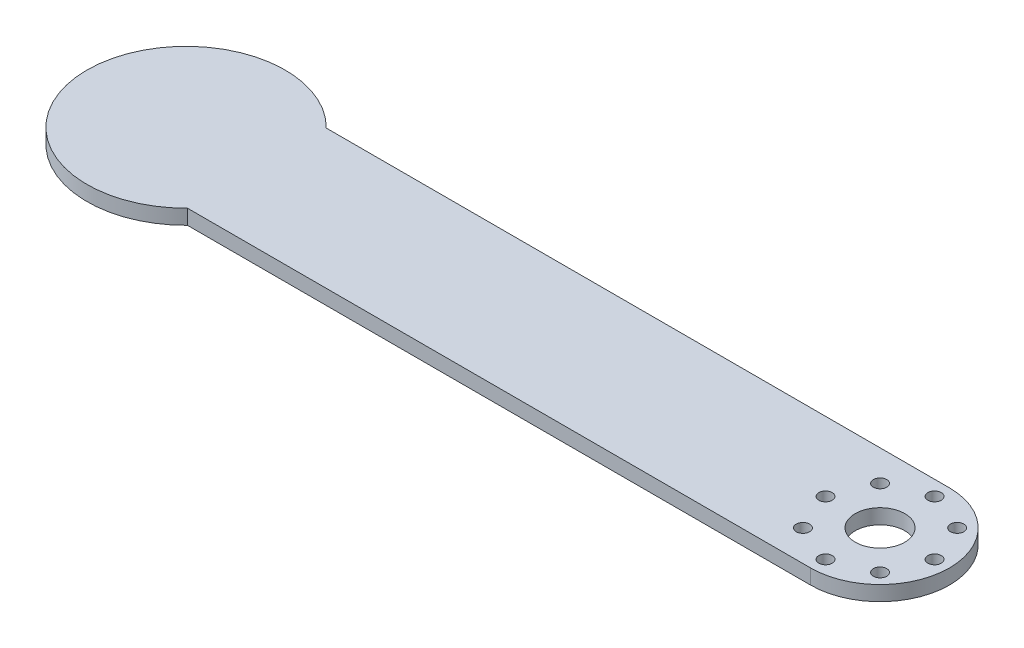
ISO-10303-21;
HEADER;
FILE_DESCRIPTION(('STEP AP214'),'2;1');
FILE_NAME('part.step','',(''),(''),'','','');
FILE_SCHEMA(('AUTOMOTIVE_DESIGN { 1 0 10303 214 1 1 1 1 }'));
ENDSEC;
DATA;
#1=APPLICATION_CONTEXT('core data for automotive mechanical design processes');
#2=APPLICATION_PROTOCOL_DEFINITION('international standard','automotive_design',2000,#1);
#3=PRODUCT_CONTEXT('',#1,'mechanical');
#4=PRODUCT('Part','Part','',(#3));
#5=PRODUCT_RELATED_PRODUCT_CATEGORY('part','',(#4));
#6=PRODUCT_DEFINITION_FORMATION('','',#4);
#7=PRODUCT_DEFINITION_CONTEXT('part definition',#1,'design');
#8=PRODUCT_DEFINITION('design','',#6,#7);
#9=PRODUCT_DEFINITION_SHAPE('','',#8);
#10=(LENGTH_UNIT() NAMED_UNIT(*) SI_UNIT(.MILLI.,.METRE.));
#11=(NAMED_UNIT(*) PLANE_ANGLE_UNIT() SI_UNIT($,.RADIAN.));
#12=(NAMED_UNIT(*) SI_UNIT($,.STERADIAN.) SOLID_ANGLE_UNIT());
#13=UNCERTAINTY_MEASURE_WITH_UNIT(LENGTH_MEASURE(1.E-05),#10,'distance_accuracy_value','');
#14=(GEOMETRIC_REPRESENTATION_CONTEXT(3) GLOBAL_UNCERTAINTY_ASSIGNED_CONTEXT((#13)) GLOBAL_UNIT_ASSIGNED_CONTEXT((#10,
#11,#12)) REPRESENTATION_CONTEXT('',''));
#15=CARTESIAN_POINT('',(0.,0.,0.));
#16=DIRECTION('',(0.,0.,1.));
#17=DIRECTION('',(1.,0.,0.));
#18=AXIS2_PLACEMENT_3D('',#15,#16,#17);
#19=CARTESIAN_POINT('',(140.,3.,0.));
#20=DIRECTION('',(0.,-1.,0.));
#21=DIRECTION('',(0.,0.,-1.));
#22=AXIS2_PLACEMENT_3D('',#19,#20,#21);
#23=PLANE('',#22);
#24=CARTESIAN_POINT('',(140.,3.,0.));
#25=DIRECTION('',(0.,1.,0.));
#26=DIRECTION('',(0.,0.,-1.));
#27=AXIS2_PLACEMENT_3D('',#24,#25,#26);
#28=CIRCLE('',#27,14.);
#29=CARTESIAN_POINT('',(140.,3.,14.));
#30=VERTEX_POINT('',#29);
#31=CARTESIAN_POINT('',(140.,3.,-14.));
#32=VERTEX_POINT('',#31);
#33=EDGE_CURVE('E87',#30,#32,#28,.T.);
#34=ORIENTED_EDGE('',*,*,#33,.T.);
#35=DIRECTION('',(-1.,0.,0.));
#36=VECTOR('',#35,1.);
#37=CARTESIAN_POINT('',(14.2828568570857,3.,-14.));
#38=LINE('',#37,#36);
#39=CARTESIAN_POINT('',(14.2828568570857,3.,-14.));
#40=VERTEX_POINT('',#39);
#41=EDGE_CURVE('E82',#32,#40,#38,.T.);
#42=ORIENTED_EDGE('',*,*,#41,.T.);
#43=CARTESIAN_POINT('',(0.,3.,0.));
#44=DIRECTION('',(0.,1.,0.));
#45=DIRECTION('',(0.,0.,1.));
#46=AXIS2_PLACEMENT_3D('',#43,#44,#45);
#47=CIRCLE('',#46,20.);
#48=CARTESIAN_POINT('',(14.2828568570857,3.,14.));
#49=VERTEX_POINT('',#48);
#50=EDGE_CURVE('E85',#40,#49,#47,.T.);
#51=ORIENTED_EDGE('',*,*,#50,.T.);
#52=DIRECTION('',(1.,0.,0.));
#53=VECTOR('',#52,1.);
#54=CARTESIAN_POINT('',(14.2828568570857,3.,14.));
#55=LINE('',#54,#53);
#56=EDGE_CURVE('E52',#49,#30,#55,.T.);
#57=ORIENTED_EDGE('',*,*,#56,.T.);
#58=EDGE_LOOP('',(#34,#42,#51,#57));
#59=FACE_BOUND('',#58,.T.);
#60=CARTESIAN_POINT('',(140.,3.,0.));
#61=DIRECTION('',(0.,1.,0.));
#62=DIRECTION('',(0.,0.,1.));
#63=AXIS2_PLACEMENT_3D('',#60,#61,#62);
#64=CIRCLE('',#63,4.99999999999999);
#65=CARTESIAN_POINT('',(140.,3.,4.99999999999998));
#66=VERTEX_POINT('',#65);
#67=EDGE_CURVE('E102',#66,#66,#64,.T.);
#68=ORIENTED_EDGE('',*,*,#67,.F.);
#69=EDGE_LOOP('',(#68));
#70=FACE_BOUND('',#69,.T.);
#71=CARTESIAN_POINT('',(140.,3.,-11.));
#72=DIRECTION('',(0.,1.,0.));
#73=DIRECTION('',(0.,0.,1.));
#74=AXIS2_PLACEMENT_3D('',#71,#72,#73);
#75=CIRCLE('',#74,1.35000000000001);
#76=CARTESIAN_POINT('',(140.,3.,-9.65));
#77=VERTEX_POINT('',#76);
#78=EDGE_CURVE('E117',#77,#77,#75,.T.);
#79=ORIENTED_EDGE('',*,*,#78,.F.);
#80=EDGE_LOOP('',(#79));
#81=FACE_BOUND('',#80,.T.);
#82=CARTESIAN_POINT('',(147.778174593052,3.,-7.77817459305199));
#83=DIRECTION('',(0.,1.,0.));
#84=DIRECTION('',(0.,0.,1.));
#85=AXIS2_PLACEMENT_3D('',#82,#83,#84);
#86=CIRCLE('',#85,1.35000000000001);
#87=CARTESIAN_POINT('',(147.778174593052,3.,-6.42817459305199));
#88=VERTEX_POINT('',#87);
#89=EDGE_CURVE('E123',#88,#88,#86,.T.);
#90=ORIENTED_EDGE('',*,*,#89,.F.);
#91=EDGE_LOOP('',(#90));
#92=FACE_BOUND('',#91,.T.);
#93=CARTESIAN_POINT('',(151.,3.,0.));
#94=DIRECTION('',(0.,1.,0.));
#95=DIRECTION('',(0.,0.,1.));
#96=AXIS2_PLACEMENT_3D('',#93,#94,#95);
#97=CIRCLE('',#96,1.35000000000001);
#98=CARTESIAN_POINT('',(151.,3.,1.35000000000002));
#99=VERTEX_POINT('',#98);
#100=EDGE_CURVE('E129',#99,#99,#97,.T.);
#101=ORIENTED_EDGE('',*,*,#100,.F.);
#102=EDGE_LOOP('',(#101));
#103=FACE_BOUND('',#102,.T.);
#104=CARTESIAN_POINT('',(147.778174593052,3.,7.77817459305202));
#105=DIRECTION('',(0.,1.,0.));
#106=DIRECTION('',(0.,0.,1.));
#107=AXIS2_PLACEMENT_3D('',#104,#105,#106);
#108=CIRCLE('',#107,1.35000000000001);
#109=CARTESIAN_POINT('',(147.778174593052,3.,9.12817459305203));
#110=VERTEX_POINT('',#109);
#111=EDGE_CURVE('E135',#110,#110,#108,.T.);
#112=ORIENTED_EDGE('',*,*,#111,.F.);
#113=EDGE_LOOP('',(#112));
#114=FACE_BOUND('',#113,.T.);
#115=CARTESIAN_POINT('',(140.,3.,11.));
#116=DIRECTION('',(0.,1.,0.));
#117=DIRECTION('',(0.,0.,1.));
#118=AXIS2_PLACEMENT_3D('',#115,#116,#117);
#119=CIRCLE('',#118,1.35000000000001);
#120=CARTESIAN_POINT('',(140.,3.,12.35));
#121=VERTEX_POINT('',#120);
#122=EDGE_CURVE('E141',#121,#121,#119,.T.);
#123=ORIENTED_EDGE('',*,*,#122,.F.);
#124=EDGE_LOOP('',(#123));
#125=FACE_BOUND('',#124,.T.);
#126=CARTESIAN_POINT('',(132.221825406948,3.,7.77817459305199));
#127=DIRECTION('',(0.,1.,0.));
#128=DIRECTION('',(0.,0.,1.));
#129=AXIS2_PLACEMENT_3D('',#126,#127,#128);
#130=CIRCLE('',#129,1.35000000000001);
#131=CARTESIAN_POINT('',(132.221825406948,3.,9.128174593052));
#132=VERTEX_POINT('',#131);
#133=EDGE_CURVE('E147',#132,#132,#130,.T.);
#134=ORIENTED_EDGE('',*,*,#133,.F.);
#135=EDGE_LOOP('',(#134));
#136=FACE_BOUND('',#135,.T.);
#137=CARTESIAN_POINT('',(129.,3.,0.));
#138=DIRECTION('',(0.,1.,0.));
#139=DIRECTION('',(0.,0.,1.));
#140=AXIS2_PLACEMENT_3D('',#137,#138,#139);
#141=CIRCLE('',#140,1.35000000000001);
#142=CARTESIAN_POINT('',(129.,3.,1.35000000000001));
#143=VERTEX_POINT('',#142);
#144=EDGE_CURVE('E153',#143,#143,#141,.T.);
#145=ORIENTED_EDGE('',*,*,#144,.F.);
#146=EDGE_LOOP('',(#145));
#147=FACE_BOUND('',#146,.T.);
#148=CARTESIAN_POINT('',(132.221825406948,3.,-7.77817459305204));
#149=DIRECTION('',(0.,1.,0.));
#150=DIRECTION('',(0.,0.,1.));
#151=AXIS2_PLACEMENT_3D('',#148,#149,#150);
#152=CIRCLE('',#151,1.35000000000004);
#153=CARTESIAN_POINT('',(132.221825406948,3.,-6.428174593052));
#154=VERTEX_POINT('',#153);
#155=EDGE_CURVE('E159',#154,#154,#152,.T.);
#156=ORIENTED_EDGE('',*,*,#155,.F.);
#157=EDGE_LOOP('',(#156));
#158=FACE_BOUND('',#157,.T.);
#159=ADVANCED_FACE('F35',(#59,#70,#81,#92,#103,#114,#125,#136,#147,#158),#23,.F.);
#160=CARTESIAN_POINT('',(140.,0.,0.));
#161=DIRECTION('',(0.,-1.,0.));
#162=DIRECTION('',(0.,0.,-1.));
#163=AXIS2_PLACEMENT_3D('',#160,#161,#162);
#164=PLANE('',#163);
#165=CARTESIAN_POINT('',(129.,0.,0.));
#166=DIRECTION('',(0.,1.,0.));
#167=DIRECTION('',(0.,0.,1.));
#168=AXIS2_PLACEMENT_3D('',#165,#166,#167);
#169=CIRCLE('',#168,1.35000000000001);
#170=CARTESIAN_POINT('',(129.,0.,1.35000000000001));
#171=VERTEX_POINT('',#170);
#172=EDGE_CURVE('E156',#171,#171,#169,.T.);
#173=ORIENTED_EDGE('',*,*,#172,.T.);
#174=EDGE_LOOP('',(#173));
#175=FACE_BOUND('',#174,.T.);
#176=CARTESIAN_POINT('',(140.,0.,11.));
#177=DIRECTION('',(0.,1.,0.));
#178=DIRECTION('',(0.,0.,1.));
#179=AXIS2_PLACEMENT_3D('',#176,#177,#178);
#180=CIRCLE('',#179,1.35000000000001);
#181=CARTESIAN_POINT('',(140.,0.,12.35));
#182=VERTEX_POINT('',#181);
#183=EDGE_CURVE('E144',#182,#182,#180,.T.);
#184=ORIENTED_EDGE('',*,*,#183,.T.);
#185=EDGE_LOOP('',(#184));
#186=FACE_BOUND('',#185,.T.);
#187=CARTESIAN_POINT('',(151.,0.,0.));
#188=DIRECTION('',(0.,1.,0.));
#189=DIRECTION('',(0.,0.,1.));
#190=AXIS2_PLACEMENT_3D('',#187,#188,#189);
#191=CIRCLE('',#190,1.35000000000001);
#192=CARTESIAN_POINT('',(151.,0.,1.35000000000002));
#193=VERTEX_POINT('',#192);
#194=EDGE_CURVE('E132',#193,#193,#191,.T.);
#195=ORIENTED_EDGE('',*,*,#194,.T.);
#196=EDGE_LOOP('',(#195));
#197=FACE_BOUND('',#196,.T.);
#198=CARTESIAN_POINT('',(140.,0.,-11.));
#199=DIRECTION('',(0.,1.,0.));
#200=DIRECTION('',(0.,0.,1.));
#201=AXIS2_PLACEMENT_3D('',#198,#199,#200);
#202=CIRCLE('',#201,1.35000000000001);
#203=CARTESIAN_POINT('',(140.,0.,-9.65));
#204=VERTEX_POINT('',#203);
#205=EDGE_CURVE('E120',#204,#204,#202,.T.);
#206=ORIENTED_EDGE('',*,*,#205,.T.);
#207=EDGE_LOOP('',(#206));
#208=FACE_BOUND('',#207,.T.);
#209=CARTESIAN_POINT('',(140.,0.,0.));
#210=DIRECTION('',(0.,1.,0.));
#211=DIRECTION('',(0.,0.,-1.));
#212=AXIS2_PLACEMENT_3D('',#209,#210,#211);
#213=CIRCLE('',#212,14.);
#214=CARTESIAN_POINT('',(140.,0.,14.));
#215=VERTEX_POINT('',#214);
#216=CARTESIAN_POINT('',(140.,0.,-14.));
#217=VERTEX_POINT('',#216);
#218=EDGE_CURVE('E99',#215,#217,#213,.T.);
#219=ORIENTED_EDGE('',*,*,#218,.F.);
#220=DIRECTION('',(1.,0.,0.));
#221=VECTOR('',#220,1.);
#222=CARTESIAN_POINT('',(14.2828568570857,0.,14.));
#223=LINE('',#222,#221);
#224=CARTESIAN_POINT('',(14.2828568570857,0.,14.));
#225=VERTEX_POINT('',#224);
#226=EDGE_CURVE('E75',#225,#215,#223,.T.);
#227=ORIENTED_EDGE('',*,*,#226,.F.);
#228=CARTESIAN_POINT('',(0.,0.,0.));
#229=DIRECTION('',(0.,1.,0.));
#230=DIRECTION('',(0.,0.,1.));
#231=AXIS2_PLACEMENT_3D('',#228,#229,#230);
#232=CIRCLE('',#231,20.);
#233=CARTESIAN_POINT('',(14.2828568570857,0.,-14.));
#234=VERTEX_POINT('',#233);
#235=EDGE_CURVE('E69',#234,#225,#232,.T.);
#236=ORIENTED_EDGE('',*,*,#235,.F.);
#237=DIRECTION('',(-1.,0.,0.));
#238=VECTOR('',#237,1.);
#239=CARTESIAN_POINT('',(14.2828568570857,0.,-14.));
#240=LINE('',#239,#238);
#241=EDGE_CURVE('E91',#217,#234,#240,.T.);
#242=ORIENTED_EDGE('',*,*,#241,.F.);
#243=EDGE_LOOP('',(#219,#227,#236,#242));
#244=FACE_BOUND('',#243,.T.);
#245=CARTESIAN_POINT('',(140.,0.,0.));
#246=DIRECTION('',(0.,1.,0.));
#247=DIRECTION('',(0.,0.,1.));
#248=AXIS2_PLACEMENT_3D('',#245,#246,#247);
#249=CIRCLE('',#248,4.99999999999999);
#250=CARTESIAN_POINT('',(140.,0.,4.99999999999998));
#251=VERTEX_POINT('',#250);
#252=EDGE_CURVE('E114',#251,#251,#249,.T.);
#253=ORIENTED_EDGE('',*,*,#252,.T.);
#254=EDGE_LOOP('',(#253));
#255=FACE_BOUND('',#254,.T.);
#256=CARTESIAN_POINT('',(147.778174593052,0.,-7.77817459305199));
#257=DIRECTION('',(0.,1.,0.));
#258=DIRECTION('',(0.,0.,1.));
#259=AXIS2_PLACEMENT_3D('',#256,#257,#258);
#260=CIRCLE('',#259,1.35000000000001);
#261=CARTESIAN_POINT('',(147.778174593052,0.,-6.42817459305199));
#262=VERTEX_POINT('',#261);
#263=EDGE_CURVE('E126',#262,#262,#260,.T.);
#264=ORIENTED_EDGE('',*,*,#263,.T.);
#265=EDGE_LOOP('',(#264));
#266=FACE_BOUND('',#265,.T.);
#267=CARTESIAN_POINT('',(147.778174593052,0.,7.77817459305202));
#268=DIRECTION('',(0.,1.,0.));
#269=DIRECTION('',(0.,0.,1.));
#270=AXIS2_PLACEMENT_3D('',#267,#268,#269);
#271=CIRCLE('',#270,1.35000000000001);
#272=CARTESIAN_POINT('',(147.778174593052,0.,9.12817459305203));
#273=VERTEX_POINT('',#272);
#274=EDGE_CURVE('E138',#273,#273,#271,.T.);
#275=ORIENTED_EDGE('',*,*,#274,.T.);
#276=EDGE_LOOP('',(#275));
#277=FACE_BOUND('',#276,.T.);
#278=CARTESIAN_POINT('',(132.221825406948,0.,7.77817459305199));
#279=DIRECTION('',(0.,1.,0.));
#280=DIRECTION('',(0.,0.,1.));
#281=AXIS2_PLACEMENT_3D('',#278,#279,#280);
#282=CIRCLE('',#281,1.35000000000001);
#283=CARTESIAN_POINT('',(132.221825406948,0.,9.128174593052));
#284=VERTEX_POINT('',#283);
#285=EDGE_CURVE('E150',#284,#284,#282,.T.);
#286=ORIENTED_EDGE('',*,*,#285,.T.);
#287=EDGE_LOOP('',(#286));
#288=FACE_BOUND('',#287,.T.);
#289=CARTESIAN_POINT('',(132.221825406948,0.,-7.77817459305204));
#290=DIRECTION('',(0.,1.,0.));
#291=DIRECTION('',(0.,0.,1.));
#292=AXIS2_PLACEMENT_3D('',#289,#290,#291);
#293=CIRCLE('',#292,1.35000000000004);
#294=CARTESIAN_POINT('',(132.221825406948,0.,-6.428174593052));
#295=VERTEX_POINT('',#294);
#296=EDGE_CURVE('E162',#295,#295,#293,.T.);
#297=ORIENTED_EDGE('',*,*,#296,.T.);
#298=EDGE_LOOP('',(#297));
#299=FACE_BOUND('',#298,.T.);
#300=ADVANCED_FACE('F110',(#175,#186,#197,#208,#244,#255,#266,#277,#288,#299),#164,.T.);
#301=CARTESIAN_POINT('',(140.,3.,0.));
#302=DIRECTION('',(0.,-1.,0.));
#303=DIRECTION('',(0.,0.,-1.));
#304=AXIS2_PLACEMENT_3D('',#301,#302,#303);
#305=CYLINDRICAL_SURFACE('',#304,14.);
#306=ORIENTED_EDGE('',*,*,#218,.T.);
#307=DIRECTION('',(0.,-1.,0.));
#308=VECTOR('',#307,1.);
#309=CARTESIAN_POINT('',(140.,3.,-14.));
#310=LINE('',#309,#308);
#311=EDGE_CURVE('E11',#32,#217,#310,.T.);
#312=ORIENTED_EDGE('',*,*,#311,.F.);
#313=ORIENTED_EDGE('',*,*,#33,.F.);
#314=DIRECTION('',(0.,-1.,0.));
#315=VECTOR('',#314,1.);
#316=CARTESIAN_POINT('',(140.,3.,14.));
#317=LINE('',#316,#315);
#318=EDGE_CURVE('E95',#30,#215,#317,.T.);
#319=ORIENTED_EDGE('',*,*,#318,.T.);
#320=EDGE_LOOP('',(#306,#312,#313,#319));
#321=FACE_BOUND('',#320,.T.);
#322=ADVANCED_FACE('F37',(#321),#305,.T.);
#323=CARTESIAN_POINT('',(14.2828568570857,3.,-14.));
#324=DIRECTION('',(0.,0.,1.));
#325=DIRECTION('',(1.,0.,0.));
#326=AXIS2_PLACEMENT_3D('',#323,#324,#325);
#327=PLANE('',#326);
#328=ORIENTED_EDGE('',*,*,#241,.T.);
#329=DIRECTION('',(0.,-1.,0.));
#330=VECTOR('',#329,1.);
#331=CARTESIAN_POINT('',(14.2828568570857,3.,-14.));
#332=LINE('',#331,#330);
#333=EDGE_CURVE('E44',#40,#234,#332,.T.);
#334=ORIENTED_EDGE('',*,*,#333,.F.);
#335=ORIENTED_EDGE('',*,*,#41,.F.);
#336=ORIENTED_EDGE('',*,*,#311,.T.);
#337=EDGE_LOOP('',(#328,#334,#335,#336));
#338=FACE_BOUND('',#337,.T.);
#339=ADVANCED_FACE('F90',(#338),#327,.F.);
#340=CARTESIAN_POINT('',(0.,3.,0.));
#341=DIRECTION('',(0.,-1.,0.));
#342=DIRECTION('',(0.,0.,-1.));
#343=AXIS2_PLACEMENT_3D('',#340,#341,#342);
#344=CYLINDRICAL_SURFACE('',#343,20.);
#345=ORIENTED_EDGE('',*,*,#235,.T.);
#346=DIRECTION('',(0.,-1.,0.));
#347=VECTOR('',#346,1.);
#348=CARTESIAN_POINT('',(14.2828568570857,3.,14.));
#349=LINE('',#348,#347);
#350=EDGE_CURVE('E92',#49,#225,#349,.T.);
#351=ORIENTED_EDGE('',*,*,#350,.F.);
#352=ORIENTED_EDGE('',*,*,#50,.F.);
#353=ORIENTED_EDGE('',*,*,#333,.T.);
#354=EDGE_LOOP('',(#345,#351,#352,#353));
#355=FACE_BOUND('',#354,.T.);
#356=ADVANCED_FACE('F93',(#355),#344,.T.);
#357=CARTESIAN_POINT('',(14.2828568570857,3.,14.));
#358=DIRECTION('',(0.,0.,-1.));
#359=DIRECTION('',(-1.,0.,0.));
#360=AXIS2_PLACEMENT_3D('',#357,#358,#359);
#361=PLANE('',#360);
#362=ORIENTED_EDGE('',*,*,#226,.T.);
#363=ORIENTED_EDGE('',*,*,#318,.F.);
#364=ORIENTED_EDGE('',*,*,#56,.F.);
#365=ORIENTED_EDGE('',*,*,#350,.T.);
#366=EDGE_LOOP('',(#362,#363,#364,#365));
#367=FACE_BOUND('',#366,.T.);
#368=ADVANCED_FACE('F107',(#367),#361,.F.);
#369=CARTESIAN_POINT('',(140.,3.,0.));
#370=DIRECTION('',(0.,-1.,0.));
#371=DIRECTION('',(0.,0.,-1.));
#372=AXIS2_PLACEMENT_3D('',#369,#370,#371);
#373=CYLINDRICAL_SURFACE('',#372,4.99999999999999);
#374=ORIENTED_EDGE('',*,*,#67,.T.);
#375=EDGE_LOOP('',(#374));
#376=FACE_BOUND('',#375,.T.);
#377=ORIENTED_EDGE('',*,*,#252,.F.);
#378=EDGE_LOOP('',(#377));
#379=FACE_BOUND('',#378,.T.);
#380=ADVANCED_FACE('F179',(#376,#379),#373,.F.);
#381=CARTESIAN_POINT('',(140.,3.,-11.));
#382=DIRECTION('',(0.,-1.,0.));
#383=DIRECTION('',(0.,0.,-1.));
#384=AXIS2_PLACEMENT_3D('',#381,#382,#383);
#385=CYLINDRICAL_SURFACE('',#384,1.35000000000001);
#386=ORIENTED_EDGE('',*,*,#78,.T.);
#387=EDGE_LOOP('',(#386));
#388=FACE_BOUND('',#387,.T.);
#389=ORIENTED_EDGE('',*,*,#205,.F.);
#390=EDGE_LOOP('',(#389));
#391=FACE_BOUND('',#390,.T.);
#392=ADVANCED_FACE('F225',(#388,#391),#385,.F.);
#393=CARTESIAN_POINT('',(147.778174593052,3.,-7.77817459305199));
#394=DIRECTION('',(0.,-1.,0.));
#395=DIRECTION('',(0.,0.,-1.));
#396=AXIS2_PLACEMENT_3D('',#393,#394,#395);
#397=CYLINDRICAL_SURFACE('',#396,1.35000000000001);
#398=ORIENTED_EDGE('',*,*,#89,.T.);
#399=EDGE_LOOP('',(#398));
#400=FACE_BOUND('',#399,.T.);
#401=ORIENTED_EDGE('',*,*,#263,.F.);
#402=EDGE_LOOP('',(#401));
#403=FACE_BOUND('',#402,.T.);
#404=ADVANCED_FACE('F233',(#400,#403),#397,.F.);
#405=CARTESIAN_POINT('',(151.,3.,0.));
#406=DIRECTION('',(0.,-1.,0.));
#407=DIRECTION('',(0.,0.,-1.));
#408=AXIS2_PLACEMENT_3D('',#405,#406,#407);
#409=CYLINDRICAL_SURFACE('',#408,1.35000000000001);
#410=ORIENTED_EDGE('',*,*,#100,.T.);
#411=EDGE_LOOP('',(#410));
#412=FACE_BOUND('',#411,.T.);
#413=ORIENTED_EDGE('',*,*,#194,.F.);
#414=EDGE_LOOP('',(#413));
#415=FACE_BOUND('',#414,.T.);
#416=ADVANCED_FACE('F241',(#412,#415),#409,.F.);
#417=CARTESIAN_POINT('',(147.778174593052,3.,7.77817459305202));
#418=DIRECTION('',(0.,-1.,0.));
#419=DIRECTION('',(0.,0.,-1.));
#420=AXIS2_PLACEMENT_3D('',#417,#418,#419);
#421=CYLINDRICAL_SURFACE('',#420,1.35000000000001);
#422=ORIENTED_EDGE('',*,*,#111,.T.);
#423=EDGE_LOOP('',(#422));
#424=FACE_BOUND('',#423,.T.);
#425=ORIENTED_EDGE('',*,*,#274,.F.);
#426=EDGE_LOOP('',(#425));
#427=FACE_BOUND('',#426,.T.);
#428=ADVANCED_FACE('F250',(#424,#427),#421,.F.);
#429=CARTESIAN_POINT('',(140.,3.,11.));
#430=DIRECTION('',(0.,-1.,0.));
#431=DIRECTION('',(0.,0.,-1.));
#432=AXIS2_PLACEMENT_3D('',#429,#430,#431);
#433=CYLINDRICAL_SURFACE('',#432,1.35000000000001);
#434=ORIENTED_EDGE('',*,*,#122,.T.);
#435=EDGE_LOOP('',(#434));
#436=FACE_BOUND('',#435,.T.);
#437=ORIENTED_EDGE('',*,*,#183,.F.);
#438=EDGE_LOOP('',(#437));
#439=FACE_BOUND('',#438,.T.);
#440=ADVANCED_FACE('F259',(#436,#439),#433,.F.);
#441=CARTESIAN_POINT('',(132.221825406948,3.,7.77817459305199));
#442=DIRECTION('',(0.,-1.,0.));
#443=DIRECTION('',(0.,0.,-1.));
#444=AXIS2_PLACEMENT_3D('',#441,#442,#443);
#445=CYLINDRICAL_SURFACE('',#444,1.35000000000001);
#446=ORIENTED_EDGE('',*,*,#133,.T.);
#447=EDGE_LOOP('',(#446));
#448=FACE_BOUND('',#447,.T.);
#449=ORIENTED_EDGE('',*,*,#285,.F.);
#450=EDGE_LOOP('',(#449));
#451=FACE_BOUND('',#450,.T.);
#452=ADVANCED_FACE('F268',(#448,#451),#445,.F.);
#453=CARTESIAN_POINT('',(129.,3.,0.));
#454=DIRECTION('',(0.,-1.,0.));
#455=DIRECTION('',(0.,0.,-1.));
#456=AXIS2_PLACEMENT_3D('',#453,#454,#455);
#457=CYLINDRICAL_SURFACE('',#456,1.35000000000001);
#458=ORIENTED_EDGE('',*,*,#144,.T.);
#459=EDGE_LOOP('',(#458));
#460=FACE_BOUND('',#459,.T.);
#461=ORIENTED_EDGE('',*,*,#172,.F.);
#462=EDGE_LOOP('',(#461));
#463=FACE_BOUND('',#462,.T.);
#464=ADVANCED_FACE('F277',(#460,#463),#457,.F.);
#465=CARTESIAN_POINT('',(132.221825406948,3.,-7.77817459305204));
#466=DIRECTION('',(0.,-1.,0.));
#467=DIRECTION('',(0.,0.,-1.));
#468=AXIS2_PLACEMENT_3D('',#465,#466,#467);
#469=CYLINDRICAL_SURFACE('',#468,1.35000000000004);
#470=ORIENTED_EDGE('',*,*,#155,.T.);
#471=EDGE_LOOP('',(#470));
#472=FACE_BOUND('',#471,.T.);
#473=ORIENTED_EDGE('',*,*,#296,.F.);
#474=EDGE_LOOP('',(#473));
#475=FACE_BOUND('',#474,.T.);
#476=ADVANCED_FACE('F168',(#472,#475),#469,.F.);
#477=CLOSED_SHELL('',(#159,#300,#322,#339,#356,#368,#380,#392,#404,#416,#428,#440,#452,#464,#476));
#478=MANIFOLD_SOLID_BREP('B2',#477);
#479=ADVANCED_BREP_SHAPE_REPRESENTATION('',(#18,#478),#14);
#480=SHAPE_DEFINITION_REPRESENTATION(#9,#479);
ENDSEC;
END-ISO-10303-21;
